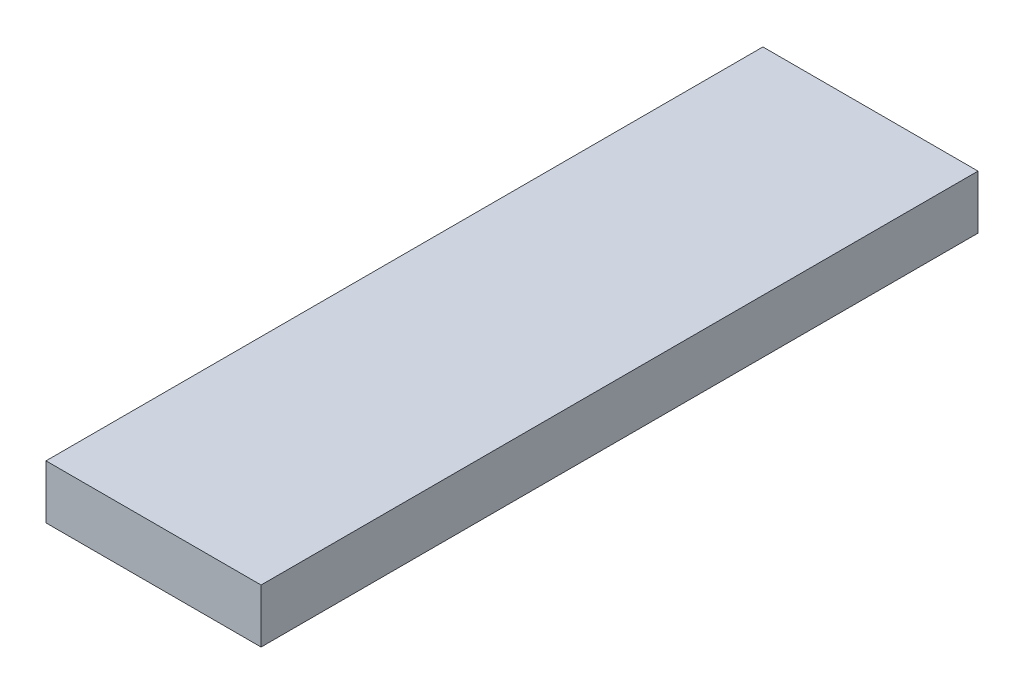
ISO-10303-21;
HEADER;
FILE_DESCRIPTION(('STEP AP214'),'2;1');
FILE_NAME('part.step','',(''),(''),'','','');
FILE_SCHEMA(('AUTOMOTIVE_DESIGN { 1 0 10303 214 1 1 1 1 }'));
ENDSEC;
DATA;
#1=APPLICATION_CONTEXT('core data for automotive mechanical design processes');
#2=APPLICATION_PROTOCOL_DEFINITION('international standard','automotive_design',2000,#1);
#3=PRODUCT_CONTEXT('',#1,'mechanical');
#4=PRODUCT('Part','Part','',(#3));
#5=PRODUCT_RELATED_PRODUCT_CATEGORY('part','',(#4));
#6=PRODUCT_DEFINITION_FORMATION('','',#4);
#7=PRODUCT_DEFINITION_CONTEXT('part definition',#1,'design');
#8=PRODUCT_DEFINITION('design','',#6,#7);
#9=PRODUCT_DEFINITION_SHAPE('','',#8);
#10=(LENGTH_UNIT() NAMED_UNIT(*) SI_UNIT(.MILLI.,.METRE.));
#11=(NAMED_UNIT(*) PLANE_ANGLE_UNIT() SI_UNIT($,.RADIAN.));
#12=(NAMED_UNIT(*) SI_UNIT($,.STERADIAN.) SOLID_ANGLE_UNIT());
#13=UNCERTAINTY_MEASURE_WITH_UNIT(LENGTH_MEASURE(1.E-05),#10,'distance_accuracy_value','');
#14=(GEOMETRIC_REPRESENTATION_CONTEXT(3) GLOBAL_UNCERTAINTY_ASSIGNED_CONTEXT((#13)) GLOBAL_UNIT_ASSIGNED_CONTEXT((#10,
#11,#12)) REPRESENTATION_CONTEXT('',''));
#15=CARTESIAN_POINT('',(0.,0.,0.));
#16=DIRECTION('',(0.,0.,1.));
#17=DIRECTION('',(1.,0.,0.));
#18=AXIS2_PLACEMENT_3D('',#15,#16,#17);
#19=CARTESIAN_POINT('',(0.,3.75,-50.));
#20=DIRECTION('',(1.,0.,0.));
#21=DIRECTION('',(0.,0.,-1.));
#22=AXIS2_PLACEMENT_3D('',#19,#20,#21);
#23=PLANE('',#22);
#24=DIRECTION('',(0.,0.,1.));
#25=VECTOR('',#24,1.);
#26=CARTESIAN_POINT('',(0.,-3.75,-50.));
#27=LINE('',#26,#25);
#28=CARTESIAN_POINT('',(0.,-3.75,-50.));
#29=VERTEX_POINT('',#28);
#30=CARTESIAN_POINT('',(0.,-3.75,50.));
#31=VERTEX_POINT('',#30);
#32=EDGE_CURVE('E130',#29,#31,#27,.T.);
#33=ORIENTED_EDGE('',*,*,#32,.T.);
#34=DIRECTION('',(0.,-1.,0.));
#35=VECTOR('',#34,1.);
#36=CARTESIAN_POINT('',(0.,3.75,50.));
#37=LINE('',#36,#35);
#38=CARTESIAN_POINT('',(0.,3.75,50.));
#39=VERTEX_POINT('',#38);
#40=EDGE_CURVE('E11',#39,#31,#37,.T.);
#41=ORIENTED_EDGE('',*,*,#40,.F.);
#42=DIRECTION('',(0.,0.,1.));
#43=VECTOR('',#42,1.);
#44=CARTESIAN_POINT('',(0.,3.75,-50.));
#45=LINE('',#44,#43);
#46=CARTESIAN_POINT('',(0.,3.75,-50.));
#47=VERTEX_POINT('',#46);
#48=EDGE_CURVE('E148',#47,#39,#45,.T.);
#49=ORIENTED_EDGE('',*,*,#48,.F.);
#50=DIRECTION('',(0.,-1.,0.));
#51=VECTOR('',#50,1.);
#52=CARTESIAN_POINT('',(0.,3.75,-50.));
#53=LINE('',#52,#51);
#54=EDGE_CURVE('E153',#47,#29,#53,.T.);
#55=ORIENTED_EDGE('',*,*,#54,.T.);
#56=EDGE_LOOP('',(#33,#41,#49,#55));
#57=FACE_BOUND('',#56,.T.);
#58=DIRECTION('',(0.,0.,1.));
#59=VECTOR('',#58,1.);
#60=CARTESIAN_POINT('',(0.,-3.25,-25.));
#61=LINE('',#60,#59);
#62=CARTESIAN_POINT('',(0.,-3.25,-25.));
#63=VERTEX_POINT('',#62);
#64=CARTESIAN_POINT('',(0.,-3.25,25.));
#65=VERTEX_POINT('',#64);
#66=EDGE_CURVE('E144',#63,#65,#61,.T.);
#67=ORIENTED_EDGE('',*,*,#66,.F.);
#68=DIRECTION('',(0.,-1.,0.));
#69=VECTOR('',#68,1.);
#70=CARTESIAN_POINT('',(0.,55.9533149445756,-25.));
#71=LINE('',#70,#69);
#72=CARTESIAN_POINT('',(0.,3.25,-25.));
#73=VERTEX_POINT('',#72);
#74=EDGE_CURVE('E142',#73,#63,#71,.T.);
#75=ORIENTED_EDGE('',*,*,#74,.F.);
#76=DIRECTION('',(0.,0.,1.));
#77=VECTOR('',#76,1.);
#78=CARTESIAN_POINT('',(0.,3.25,-25.));
#79=LINE('',#78,#77);
#80=CARTESIAN_POINT('',(0.,3.25,25.));
#81=VERTEX_POINT('',#80);
#82=EDGE_CURVE('E131',#73,#81,#79,.T.);
#83=ORIENTED_EDGE('',*,*,#82,.T.);
#84=DIRECTION('',(0.,-1.,0.));
#85=VECTOR('',#84,1.);
#86=CARTESIAN_POINT('',(0.,55.9533149445756,25.));
#87=LINE('',#86,#85);
#88=EDGE_CURVE('E51',#81,#65,#87,.T.);
#89=ORIENTED_EDGE('',*,*,#88,.T.);
#90=EDGE_LOOP('',(#67,#75,#83,#89));
#91=FACE_BOUND('',#90,.T.);
#92=ADVANCED_FACE('F37',(#57,#91),#23,.F.);
#93=CARTESIAN_POINT('',(0.,3.75,50.));
#94=DIRECTION('',(0.,0.,-1.));
#95=DIRECTION('',(-1.,0.,0.));
#96=AXIS2_PLACEMENT_3D('',#93,#94,#95);
#97=PLANE('',#96);
#98=DIRECTION('',(1.,0.,0.));
#99=VECTOR('',#98,1.);
#100=CARTESIAN_POINT('',(0.,-3.75,50.));
#101=LINE('',#100,#99);
#102=CARTESIAN_POINT('',(30.,-3.75,50.));
#103=VERTEX_POINT('',#102);
#104=EDGE_CURVE('E134',#31,#103,#101,.T.);
#105=ORIENTED_EDGE('',*,*,#104,.T.);
#106=DIRECTION('',(0.,-1.,0.));
#107=VECTOR('',#106,1.);
#108=CARTESIAN_POINT('',(30.,3.75,50.));
#109=LINE('',#108,#107);
#110=CARTESIAN_POINT('',(30.,3.75,50.));
#111=VERTEX_POINT('',#110);
#112=EDGE_CURVE('E44',#111,#103,#109,.T.);
#113=ORIENTED_EDGE('',*,*,#112,.F.);
#114=DIRECTION('',(1.,0.,0.));
#115=VECTOR('',#114,1.);
#116=CARTESIAN_POINT('',(0.,3.75,50.));
#117=LINE('',#116,#115);
#118=EDGE_CURVE('E88',#39,#111,#117,.T.);
#119=ORIENTED_EDGE('',*,*,#118,.F.);
#120=ORIENTED_EDGE('',*,*,#40,.T.);
#121=EDGE_LOOP('',(#105,#113,#119,#120));
#122=FACE_BOUND('',#121,.T.);
#123=ADVANCED_FACE('F183',(#122),#97,.F.);
#124=CARTESIAN_POINT('',(30.,3.75,-50.));
#125=DIRECTION('',(-1.,0.,0.));
#126=DIRECTION('',(0.,0.,1.));
#127=AXIS2_PLACEMENT_3D('',#124,#125,#126);
#128=PLANE('',#127);
#129=DIRECTION('',(0.,0.,-1.));
#130=VECTOR('',#129,1.);
#131=CARTESIAN_POINT('',(30.,-3.75,-50.));
#132=LINE('',#131,#130);
#133=CARTESIAN_POINT('',(30.,-3.75,-50.));
#134=VERTEX_POINT('',#133);
#135=EDGE_CURVE('E156',#103,#134,#132,.T.);
#136=ORIENTED_EDGE('',*,*,#135,.T.);
#137=DIRECTION('',(0.,-1.,0.));
#138=VECTOR('',#137,1.);
#139=CARTESIAN_POINT('',(30.,3.75,-50.));
#140=LINE('',#139,#138);
#141=CARTESIAN_POINT('',(30.,3.75,-50.));
#142=VERTEX_POINT('',#141);
#143=EDGE_CURVE('E160',#142,#134,#140,.T.);
#144=ORIENTED_EDGE('',*,*,#143,.F.);
#145=DIRECTION('',(0.,0.,-1.));
#146=VECTOR('',#145,1.);
#147=CARTESIAN_POINT('',(30.,3.75,-50.));
#148=LINE('',#147,#146);
#149=EDGE_CURVE('E151',#111,#142,#148,.T.);
#150=ORIENTED_EDGE('',*,*,#149,.F.);
#151=ORIENTED_EDGE('',*,*,#112,.T.);
#152=EDGE_LOOP('',(#136,#144,#150,#151));
#153=FACE_BOUND('',#152,.T.);
#154=ADVANCED_FACE('F165',(#153),#128,.F.);
#155=CARTESIAN_POINT('',(0.,3.75,-50.));
#156=DIRECTION('',(0.,0.,1.));
#157=DIRECTION('',(1.,0.,0.));
#158=AXIS2_PLACEMENT_3D('',#155,#156,#157);
#159=PLANE('',#158);
#160=DIRECTION('',(-1.,0.,0.));
#161=VECTOR('',#160,1.);
#162=CARTESIAN_POINT('',(0.,-3.75,-50.));
#163=LINE('',#162,#161);
#164=EDGE_CURVE('E81',#134,#29,#163,.T.);
#165=ORIENTED_EDGE('',*,*,#164,.T.);
#166=ORIENTED_EDGE('',*,*,#54,.F.);
#167=DIRECTION('',(-1.,0.,0.));
#168=VECTOR('',#167,1.);
#169=CARTESIAN_POINT('',(0.,3.75,-50.));
#170=LINE('',#169,#168);
#171=EDGE_CURVE('E60',#142,#47,#170,.T.);
#172=ORIENTED_EDGE('',*,*,#171,.F.);
#173=ORIENTED_EDGE('',*,*,#143,.T.);
#174=EDGE_LOOP('',(#165,#166,#172,#173));
#175=FACE_BOUND('',#174,.T.);
#176=ADVANCED_FACE('F174',(#175),#159,.F.);
#177=CARTESIAN_POINT('',(0.,3.75,0.));
#178=DIRECTION('',(0.,1.,0.));
#179=DIRECTION('',(0.,0.,1.));
#180=AXIS2_PLACEMENT_3D('',#177,#178,#179);
#181=PLANE('',#180);
#182=ORIENTED_EDGE('',*,*,#48,.T.);
#183=ORIENTED_EDGE('',*,*,#118,.T.);
#184=ORIENTED_EDGE('',*,*,#149,.T.);
#185=ORIENTED_EDGE('',*,*,#171,.T.);
#186=EDGE_LOOP('',(#182,#183,#184,#185));
#187=FACE_BOUND('',#186,.T.);
#188=ADVANCED_FACE('F176',(#187),#181,.T.);
#189=CARTESIAN_POINT('',(0.,-3.75,0.));
#190=DIRECTION('',(0.,1.,0.));
#191=DIRECTION('',(0.,0.,1.));
#192=AXIS2_PLACEMENT_3D('',#189,#190,#191);
#193=PLANE('',#192);
#194=ORIENTED_EDGE('',*,*,#32,.F.);
#195=ORIENTED_EDGE('',*,*,#164,.F.);
#196=ORIENTED_EDGE('',*,*,#135,.F.);
#197=ORIENTED_EDGE('',*,*,#104,.F.);
#198=EDGE_LOOP('',(#194,#195,#196,#197));
#199=FACE_BOUND('',#198,.T.);
#200=ADVANCED_FACE('F169',(#199),#193,.F.);
#201=CARTESIAN_POINT('',(15.,55.9533149445756,-25.2618259739232));
#202=DIRECTION('',(0.017452406437281,0.,0.999847695156391));
#203=DIRECTION('',(0.999847695156391,0.,-0.017452406437281));
#204=AXIS2_PLACEMENT_3D('',#201,#202,#203);
#205=PLANE('',#204);
#206=DIRECTION('',(-0.999847695156391,0.,0.017452406437281));
#207=VECTOR('',#206,1.);
#208=CARTESIAN_POINT('',(15.,3.25,-25.2618259739232));
#209=LINE('',#208,#207);
#210=CARTESIAN_POINT('',(15.,3.25,-25.2618259739232));
#211=VERTEX_POINT('',#210);
#212=EDGE_CURVE('E127',#211,#73,#209,.T.);
#213=ORIENTED_EDGE('',*,*,#212,.T.);
#214=ORIENTED_EDGE('',*,*,#74,.T.);
#215=DIRECTION('',(-0.999847695156391,0.,0.017452406437281));
#216=VECTOR('',#215,1.);
#217=CARTESIAN_POINT('',(15.,-3.25,-25.2618259739232));
#218=LINE('',#217,#216);
#219=CARTESIAN_POINT('',(15.,-3.25,-25.2618259739232));
#220=VERTEX_POINT('',#219);
#221=EDGE_CURVE('E138',#220,#63,#218,.T.);
#222=ORIENTED_EDGE('',*,*,#221,.F.);
#223=DIRECTION('',(0.,-1.,0.));
#224=VECTOR('',#223,1.);
#225=CARTESIAN_POINT('',(15.,55.9533149445756,-25.2618259739232));
#226=LINE('',#225,#224);
#227=EDGE_CURVE('E146',#211,#220,#226,.T.);
#228=ORIENTED_EDGE('',*,*,#227,.F.);
#229=EDGE_LOOP('',(#213,#214,#222,#228));
#230=FACE_BOUND('',#229,.T.);
#231=ADVANCED_FACE('F215',(#230),#205,.T.);
#232=CARTESIAN_POINT('',(0.,55.9533149445756,25.));
#233=DIRECTION('',(0.0174524064372811,0.,-0.999847695156391));
#234=DIRECTION('',(-0.999847695156391,0.,-0.0174524064372811));
#235=AXIS2_PLACEMENT_3D('',#232,#233,#234);
#236=PLANE('',#235);
#237=DIRECTION('',(0.999847695156391,0.,0.0174524064372811));
#238=VECTOR('',#237,1.);
#239=CARTESIAN_POINT('',(0.,3.25,25.));
#240=LINE('',#239,#238);
#241=CARTESIAN_POINT('',(15.,3.25,25.2618259739232));
#242=VERTEX_POINT('',#241);
#243=EDGE_CURVE('E124',#81,#242,#240,.T.);
#244=ORIENTED_EDGE('',*,*,#243,.T.);
#245=DIRECTION('',(0.,-1.,0.));
#246=VECTOR('',#245,1.);
#247=CARTESIAN_POINT('',(15.,55.9533149445756,25.2618259739232));
#248=LINE('',#247,#246);
#249=CARTESIAN_POINT('',(15.,-3.25,25.2618259739232));
#250=VERTEX_POINT('',#249);
#251=EDGE_CURVE('E112',#242,#250,#248,.T.);
#252=ORIENTED_EDGE('',*,*,#251,.T.);
#253=DIRECTION('',(0.999847695156391,0.,0.0174524064372811));
#254=VECTOR('',#253,1.);
#255=CARTESIAN_POINT('',(0.,-3.25,25.));
#256=LINE('',#255,#254);
#257=EDGE_CURVE('E119',#65,#250,#256,.T.);
#258=ORIENTED_EDGE('',*,*,#257,.F.);
#259=ORIENTED_EDGE('',*,*,#88,.F.);
#260=EDGE_LOOP('',(#244,#252,#258,#259));
#261=FACE_BOUND('',#260,.T.);
#262=ADVANCED_FACE('F129',(#261),#236,.T.);
#263=CARTESIAN_POINT('',(15.,55.9533149445756,25.2618259739232));
#264=DIRECTION('',(-1.,0.,0.));
#265=DIRECTION('',(0.,0.,1.));
#266=AXIS2_PLACEMENT_3D('',#263,#264,#265);
#267=PLANE('',#266);
#268=DIRECTION('',(0.,0.,-1.));
#269=VECTOR('',#268,1.);
#270=CARTESIAN_POINT('',(15.,3.25,25.2618259739232));
#271=LINE('',#270,#269);
#272=EDGE_CURVE('E115',#242,#211,#271,.T.);
#273=ORIENTED_EDGE('',*,*,#272,.T.);
#274=ORIENTED_EDGE('',*,*,#227,.T.);
#275=DIRECTION('',(0.,0.,-1.));
#276=VECTOR('',#275,1.);
#277=CARTESIAN_POINT('',(15.,-3.25,25.2618259739232));
#278=LINE('',#277,#276);
#279=EDGE_CURVE('E117',#250,#220,#278,.T.);
#280=ORIENTED_EDGE('',*,*,#279,.F.);
#281=ORIENTED_EDGE('',*,*,#251,.F.);
#282=EDGE_LOOP('',(#273,#274,#280,#281));
#283=FACE_BOUND('',#282,.T.);
#284=ADVANCED_FACE('F114',(#283),#267,.T.);
#285=CARTESIAN_POINT('',(0.,-3.25,0.));
#286=DIRECTION('',(0.,1.,0.));
#287=DIRECTION('',(0.,0.,1.));
#288=AXIS2_PLACEMENT_3D('',#285,#286,#287);
#289=PLANE('',#288);
#290=ORIENTED_EDGE('',*,*,#221,.T.);
#291=ORIENTED_EDGE('',*,*,#66,.T.);
#292=ORIENTED_EDGE('',*,*,#257,.T.);
#293=ORIENTED_EDGE('',*,*,#279,.T.);
#294=EDGE_LOOP('',(#290,#291,#292,#293));
#295=FACE_BOUND('',#294,.T.);
#296=ADVANCED_FACE('F246',(#295),#289,.T.);
#297=CARTESIAN_POINT('',(0.,3.25,0.));
#298=DIRECTION('',(0.,1.,0.));
#299=DIRECTION('',(0.,0.,1.));
#300=AXIS2_PLACEMENT_3D('',#297,#298,#299);
#301=PLANE('',#300);
#302=ORIENTED_EDGE('',*,*,#272,.F.);
#303=ORIENTED_EDGE('',*,*,#243,.F.);
#304=ORIENTED_EDGE('',*,*,#82,.F.);
#305=ORIENTED_EDGE('',*,*,#212,.F.);
#306=EDGE_LOOP('',(#302,#303,#304,#305));
#307=FACE_BOUND('',#306,.T.);
#308=ADVANCED_FACE('F123',(#307),#301,.F.);
#309=CLOSED_SHELL('',(#92,#123,#154,#176,#188,#200,#231,#262,#284,#296,#308));
#310=MANIFOLD_SOLID_BREP('B2',#309);
#311=ADVANCED_BREP_SHAPE_REPRESENTATION('',(#18,#310),#14);
#312=SHAPE_DEFINITION_REPRESENTATION(#9,#311);
ENDSEC;
END-ISO-10303-21;
